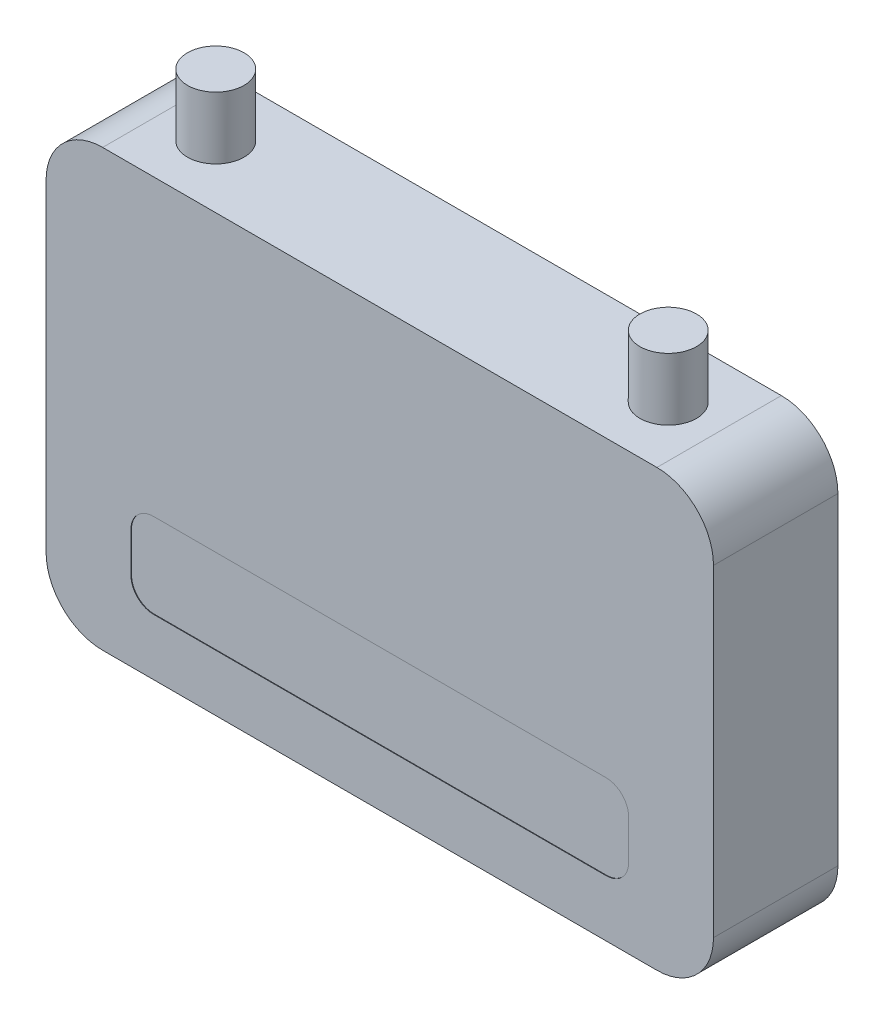
ISO-10303-21;
HEADER;
FILE_DESCRIPTION(('STEP AP214'),'2;1');
FILE_NAME('part.step','',(''),(''),'','','');
FILE_SCHEMA(('AUTOMOTIVE_DESIGN { 1 0 10303 214 1 1 1 1 }'));
ENDSEC;
DATA;
#1=APPLICATION_CONTEXT('core data for automotive mechanical design processes');
#2=APPLICATION_PROTOCOL_DEFINITION('international standard','automotive_design',2000,#1);
#3=PRODUCT_CONTEXT('',#1,'mechanical');
#4=PRODUCT('Part','Part','',(#3));
#5=PRODUCT_RELATED_PRODUCT_CATEGORY('part','',(#4));
#6=PRODUCT_DEFINITION_FORMATION('','',#4);
#7=PRODUCT_DEFINITION_CONTEXT('part definition',#1,'design');
#8=PRODUCT_DEFINITION('design','',#6,#7);
#9=PRODUCT_DEFINITION_SHAPE('','',#8);
#10=(LENGTH_UNIT() NAMED_UNIT(*) SI_UNIT(.MILLI.,.METRE.));
#11=(NAMED_UNIT(*) PLANE_ANGLE_UNIT() SI_UNIT($,.RADIAN.));
#12=(NAMED_UNIT(*) SI_UNIT($,.STERADIAN.) SOLID_ANGLE_UNIT());
#13=UNCERTAINTY_MEASURE_WITH_UNIT(LENGTH_MEASURE(1.E-05),#10,'distance_accuracy_value','');
#14=(GEOMETRIC_REPRESENTATION_CONTEXT(3) GLOBAL_UNCERTAINTY_ASSIGNED_CONTEXT((#13)) GLOBAL_UNIT_ASSIGNED_CONTEXT((#10,
#11,#12)) REPRESENTATION_CONTEXT('',''));
#15=CARTESIAN_POINT('',(0.,0.,0.));
#16=DIRECTION('',(0.,0.,1.));
#17=DIRECTION('',(1.,0.,0.));
#18=AXIS2_PLACEMENT_3D('',#15,#16,#17);
#19=CARTESIAN_POINT('',(49.,28.5,11.));
#20=DIRECTION('',(0.,0.,-1.));
#21=DIRECTION('',(-1.,0.,0.));
#22=AXIS2_PLACEMENT_3D('',#19,#20,#21);
#23=CYLINDRICAL_SURFACE('',#22,10.);
#24=CARTESIAN_POINT('',(49.,28.5,-11.));
#25=DIRECTION('',(0.,0.,1.));
#26=DIRECTION('',(-1.,0.,0.));
#27=AXIS2_PLACEMENT_3D('',#24,#25,#26);
#28=CIRCLE('',#27,10.);
#29=CARTESIAN_POINT('',(59.,28.4999999999999,-11.));
#30=VERTEX_POINT('',#29);
#31=CARTESIAN_POINT('',(48.9999999999999,38.5,-11.));
#32=VERTEX_POINT('',#31);
#33=EDGE_CURVE('E147',#30,#32,#28,.T.);
#34=ORIENTED_EDGE('',*,*,#33,.T.);
#35=DIRECTION('',(0.,0.,-1.));
#36=VECTOR('',#35,1.);
#37=CARTESIAN_POINT('',(48.9999999999999,38.5,11.));
#38=LINE('',#37,#36);
#39=CARTESIAN_POINT('',(48.9999999999999,38.5,11.));
#40=VERTEX_POINT('',#39);
#41=EDGE_CURVE('E176',#40,#32,#38,.T.);
#42=ORIENTED_EDGE('',*,*,#41,.F.);
#43=CARTESIAN_POINT('',(49.,28.5,11.));
#44=DIRECTION('',(0.,0.,1.));
#45=DIRECTION('',(-1.,0.,0.));
#46=AXIS2_PLACEMENT_3D('',#43,#44,#45);
#47=CIRCLE('',#46,10.);
#48=CARTESIAN_POINT('',(59.,28.4999999999999,11.));
#49=VERTEX_POINT('',#48);
#50=EDGE_CURVE('E163',#49,#40,#47,.T.);
#51=ORIENTED_EDGE('',*,*,#50,.F.);
#52=DIRECTION('',(0.,0.,-1.));
#53=VECTOR('',#52,1.);
#54=CARTESIAN_POINT('',(59.,28.4999999999999,11.));
#55=LINE('',#54,#53);
#56=EDGE_CURVE('E143',#49,#30,#55,.T.);
#57=ORIENTED_EDGE('',*,*,#56,.T.);
#58=EDGE_LOOP('',(#34,#42,#51,#57));
#59=FACE_BOUND('',#58,.T.);
#60=ADVANCED_FACE('F37',(#59),#23,.T.);
#61=CARTESIAN_POINT('',(-48.9999999999999,38.5,11.));
#62=DIRECTION('',(0.,-1.,0.));
#63=DIRECTION('',(0.,0.,-1.));
#64=AXIS2_PLACEMENT_3D('',#61,#62,#63);
#65=PLANE('',#64);
#66=CARTESIAN_POINT('',(40.,38.5,0.));
#67=DIRECTION('',(0.,-1.,0.));
#68=DIRECTION('',(0.,0.,-1.));
#69=AXIS2_PLACEMENT_3D('',#66,#67,#68);
#70=CIRCLE('',#69,5.);
#71=CARTESIAN_POINT('',(40.,38.5,-5.00000000000001));
#72=VERTEX_POINT('',#71);
#73=EDGE_CURVE('E181',#72,#72,#70,.F.);
#74=ORIENTED_EDGE('',*,*,#73,.F.);
#75=EDGE_LOOP('',(#74));
#76=FACE_BOUND('',#75,.T.);
#77=CARTESIAN_POINT('',(-40.,38.5,0.));
#78=DIRECTION('',(0.,-1.,0.));
#79=DIRECTION('',(0.,0.,-1.));
#80=AXIS2_PLACEMENT_3D('',#77,#78,#79);
#81=CIRCLE('',#80,5.);
#82=CARTESIAN_POINT('',(-40.,38.5,-5.));
#83=VERTEX_POINT('',#82);
#84=EDGE_CURVE('E178',#83,#83,#81,.F.);
#85=ORIENTED_EDGE('',*,*,#84,.F.);
#86=EDGE_LOOP('',(#85));
#87=FACE_BOUND('',#86,.T.);
#88=DIRECTION('',(-1.,0.,0.));
#89=VECTOR('',#88,1.);
#90=CARTESIAN_POINT('',(-48.9999999999999,38.5,-11.));
#91=LINE('',#90,#89);
#92=CARTESIAN_POINT('',(-48.9999999999999,38.5,-11.));
#93=VERTEX_POINT('',#92);
#94=EDGE_CURVE('E150',#32,#93,#91,.T.);
#95=ORIENTED_EDGE('',*,*,#94,.T.);
#96=DIRECTION('',(0.,0.,-1.));
#97=VECTOR('',#96,1.);
#98=CARTESIAN_POINT('',(-48.9999999999999,38.5,11.));
#99=LINE('',#98,#97);
#100=CARTESIAN_POINT('',(-48.9999999999999,38.5,11.));
#101=VERTEX_POINT('',#100);
#102=EDGE_CURVE('E173',#101,#93,#99,.T.);
#103=ORIENTED_EDGE('',*,*,#102,.F.);
#104=DIRECTION('',(-1.,0.,0.));
#105=VECTOR('',#104,1.);
#106=CARTESIAN_POINT('',(-48.9999999999999,38.5,11.));
#107=LINE('',#106,#105);
#108=EDGE_CURVE('E103',#40,#101,#107,.T.);
#109=ORIENTED_EDGE('',*,*,#108,.F.);
#110=ORIENTED_EDGE('',*,*,#41,.T.);
#111=EDGE_LOOP('',(#95,#103,#109,#110));
#112=FACE_BOUND('',#111,.T.);
#113=ADVANCED_FACE('F223',(#76,#87,#112),#65,.F.);
#114=CARTESIAN_POINT('',(-49.,28.5,11.));
#115=DIRECTION('',(0.,0.,-1.));
#116=DIRECTION('',(-1.,0.,0.));
#117=AXIS2_PLACEMENT_3D('',#114,#115,#116);
#118=CYLINDRICAL_SURFACE('',#117,10.);
#119=CARTESIAN_POINT('',(-49.,28.5,-11.));
#120=DIRECTION('',(0.,0.,1.));
#121=DIRECTION('',(-1.,0.,0.));
#122=AXIS2_PLACEMENT_3D('',#119,#120,#121);
#123=CIRCLE('',#122,10.);
#124=CARTESIAN_POINT('',(-59.,28.4999999999999,-11.));
#125=VERTEX_POINT('',#124);
#126=EDGE_CURVE('E153',#93,#125,#123,.T.);
#127=ORIENTED_EDGE('',*,*,#126,.T.);
#128=DIRECTION('',(0.,0.,-1.));
#129=VECTOR('',#128,1.);
#130=CARTESIAN_POINT('',(-59.,28.4999999999999,11.));
#131=LINE('',#130,#129);
#132=CARTESIAN_POINT('',(-59.,28.4999999999999,11.));
#133=VERTEX_POINT('',#132);
#134=EDGE_CURVE('E170',#133,#125,#131,.T.);
#135=ORIENTED_EDGE('',*,*,#134,.F.);
#136=CARTESIAN_POINT('',(-49.,28.5,11.));
#137=DIRECTION('',(0.,0.,1.));
#138=DIRECTION('',(-1.,0.,0.));
#139=AXIS2_PLACEMENT_3D('',#136,#137,#138);
#140=CIRCLE('',#139,10.);
#141=EDGE_CURVE('E310',#101,#133,#140,.T.);
#142=ORIENTED_EDGE('',*,*,#141,.F.);
#143=ORIENTED_EDGE('',*,*,#102,.T.);
#144=EDGE_LOOP('',(#127,#135,#142,#143));
#145=FACE_BOUND('',#144,.T.);
#146=ADVANCED_FACE('F229',(#145),#118,.T.);
#147=CARTESIAN_POINT('',(-59.,-28.4999999999999,11.));
#148=DIRECTION('',(1.,0.,0.));
#149=DIRECTION('',(0.,0.,-1.));
#150=AXIS2_PLACEMENT_3D('',#147,#148,#149);
#151=PLANE('',#150);
#152=DIRECTION('',(0.,-1.,0.));
#153=VECTOR('',#152,1.);
#154=CARTESIAN_POINT('',(-59.,-28.4999999999999,-11.));
#155=LINE('',#154,#153);
#156=CARTESIAN_POINT('',(-59.,-28.4999999999999,-11.));
#157=VERTEX_POINT('',#156);
#158=EDGE_CURVE('E155',#125,#157,#155,.T.);
#159=ORIENTED_EDGE('',*,*,#158,.T.);
#160=DIRECTION('',(0.,0.,-1.));
#161=VECTOR('',#160,1.);
#162=CARTESIAN_POINT('',(-59.,-28.4999999999999,11.));
#163=LINE('',#162,#161);
#164=CARTESIAN_POINT('',(-59.,-28.4999999999999,11.));
#165=VERTEX_POINT('',#164);
#166=EDGE_CURVE('E167',#165,#157,#163,.T.);
#167=ORIENTED_EDGE('',*,*,#166,.F.);
#168=DIRECTION('',(0.,-1.,0.));
#169=VECTOR('',#168,1.);
#170=CARTESIAN_POINT('',(-59.,-28.4999999999999,11.));
#171=LINE('',#170,#169);
#172=EDGE_CURVE('E307',#133,#165,#171,.T.);
#173=ORIENTED_EDGE('',*,*,#172,.F.);
#174=ORIENTED_EDGE('',*,*,#134,.T.);
#175=EDGE_LOOP('',(#159,#167,#173,#174));
#176=FACE_BOUND('',#175,.T.);
#177=ADVANCED_FACE('F292',(#176),#151,.F.);
#178=CARTESIAN_POINT('',(-49.,-28.5,11.));
#179=DIRECTION('',(0.,0.,-1.));
#180=DIRECTION('',(-1.,0.,0.));
#181=AXIS2_PLACEMENT_3D('',#178,#179,#180);
#182=CYLINDRICAL_SURFACE('',#181,10.);
#183=CARTESIAN_POINT('',(-49.,-28.5,-11.));
#184=DIRECTION('',(0.,0.,1.));
#185=DIRECTION('',(-1.,0.,0.));
#186=AXIS2_PLACEMENT_3D('',#183,#184,#185);
#187=CIRCLE('',#186,10.);
#188=CARTESIAN_POINT('',(-48.9999999999999,-38.5,-11.));
#189=VERTEX_POINT('',#188);
#190=EDGE_CURVE('E157',#157,#189,#187,.T.);
#191=ORIENTED_EDGE('',*,*,#190,.T.);
#192=DIRECTION('',(0.,0.,-1.));
#193=VECTOR('',#192,1.);
#194=CARTESIAN_POINT('',(-48.9999999999999,-38.5,11.));
#195=LINE('',#194,#193);
#196=CARTESIAN_POINT('',(-48.9999999999999,-38.5,11.));
#197=VERTEX_POINT('',#196);
#198=EDGE_CURVE('E138',#197,#189,#195,.T.);
#199=ORIENTED_EDGE('',*,*,#198,.F.);
#200=CARTESIAN_POINT('',(-49.,-28.5,11.));
#201=DIRECTION('',(0.,0.,1.));
#202=DIRECTION('',(-1.,0.,0.));
#203=AXIS2_PLACEMENT_3D('',#200,#201,#202);
#204=CIRCLE('',#203,10.);
#205=EDGE_CURVE('E126',#165,#197,#204,.T.);
#206=ORIENTED_EDGE('',*,*,#205,.F.);
#207=ORIENTED_EDGE('',*,*,#166,.T.);
#208=EDGE_LOOP('',(#191,#199,#206,#207));
#209=FACE_BOUND('',#208,.T.);
#210=ADVANCED_FACE('F289',(#209),#182,.T.);
#211=CARTESIAN_POINT('',(-48.9999999999999,-38.5,11.));
#212=DIRECTION('',(0.,1.,0.));
#213=DIRECTION('',(0.,0.,1.));
#214=AXIS2_PLACEMENT_3D('',#211,#212,#213);
#215=PLANE('',#214);
#216=DIRECTION('',(1.,0.,0.));
#217=VECTOR('',#216,1.);
#218=CARTESIAN_POINT('',(-48.9999999999999,-38.5,-11.));
#219=LINE('',#218,#217);
#220=CARTESIAN_POINT('',(48.9999999999999,-38.5,-11.));
#221=VERTEX_POINT('',#220);
#222=EDGE_CURVE('E135',#189,#221,#219,.T.);
#223=ORIENTED_EDGE('',*,*,#222,.T.);
#224=DIRECTION('',(0.,0.,-1.));
#225=VECTOR('',#224,1.);
#226=CARTESIAN_POINT('',(48.9999999999999,-38.5,11.));
#227=LINE('',#226,#225);
#228=CARTESIAN_POINT('',(48.9999999999999,-38.5,11.));
#229=VERTEX_POINT('',#228);
#230=EDGE_CURVE('E132',#229,#221,#227,.T.);
#231=ORIENTED_EDGE('',*,*,#230,.F.);
#232=DIRECTION('',(1.,0.,0.));
#233=VECTOR('',#232,1.);
#234=CARTESIAN_POINT('',(-48.9999999999999,-38.5,11.));
#235=LINE('',#234,#233);
#236=EDGE_CURVE('E119',#197,#229,#235,.T.);
#237=ORIENTED_EDGE('',*,*,#236,.F.);
#238=ORIENTED_EDGE('',*,*,#198,.T.);
#239=EDGE_LOOP('',(#223,#231,#237,#238));
#240=FACE_BOUND('',#239,.T.);
#241=ADVANCED_FACE('F133',(#240),#215,.F.);
#242=CARTESIAN_POINT('',(49.,-28.5,11.));
#243=DIRECTION('',(0.,0.,-1.));
#244=DIRECTION('',(-1.,0.,0.));
#245=AXIS2_PLACEMENT_3D('',#242,#243,#244);
#246=CYLINDRICAL_SURFACE('',#245,10.);
#247=CARTESIAN_POINT('',(49.,-28.5,-11.));
#248=DIRECTION('',(0.,0.,1.));
#249=DIRECTION('',(1.,0.,0.));
#250=AXIS2_PLACEMENT_3D('',#247,#248,#249);
#251=CIRCLE('',#250,10.);
#252=CARTESIAN_POINT('',(59.,-28.5,-11.));
#253=VERTEX_POINT('',#252);
#254=EDGE_CURVE('E160',#221,#253,#251,.T.);
#255=ORIENTED_EDGE('',*,*,#254,.T.);
#256=DIRECTION('',(0.,0.,-1.));
#257=VECTOR('',#256,1.);
#258=CARTESIAN_POINT('',(59.,-28.5,11.));
#259=LINE('',#258,#257);
#260=CARTESIAN_POINT('',(59.,-28.5,11.));
#261=VERTEX_POINT('',#260);
#262=EDGE_CURVE('E139',#261,#253,#259,.T.);
#263=ORIENTED_EDGE('',*,*,#262,.F.);
#264=CARTESIAN_POINT('',(49.,-28.5,11.));
#265=DIRECTION('',(0.,0.,1.));
#266=DIRECTION('',(1.,0.,0.));
#267=AXIS2_PLACEMENT_3D('',#264,#265,#266);
#268=CIRCLE('',#267,10.);
#269=EDGE_CURVE('E123',#229,#261,#268,.T.);
#270=ORIENTED_EDGE('',*,*,#269,.F.);
#271=ORIENTED_EDGE('',*,*,#230,.T.);
#272=EDGE_LOOP('',(#255,#263,#270,#271));
#273=FACE_BOUND('',#272,.T.);
#274=ADVANCED_FACE('F141',(#273),#246,.T.);
#275=CARTESIAN_POINT('',(59.,-28.4999999999999,11.));
#276=DIRECTION('',(-1.,0.,0.));
#277=DIRECTION('',(0.,0.,1.));
#278=AXIS2_PLACEMENT_3D('',#275,#276,#277);
#279=PLANE('',#278);
#280=DIRECTION('',(0.,1.,0.));
#281=VECTOR('',#280,1.);
#282=CARTESIAN_POINT('',(59.,-28.4999999999999,-11.));
#283=LINE('',#282,#281);
#284=EDGE_CURVE('E94',#253,#30,#283,.T.);
#285=ORIENTED_EDGE('',*,*,#284,.T.);
#286=ORIENTED_EDGE('',*,*,#56,.F.);
#287=DIRECTION('',(0.,1.,0.));
#288=VECTOR('',#287,1.);
#289=CARTESIAN_POINT('',(59.,-28.4999999999999,11.));
#290=LINE('',#289,#288);
#291=EDGE_CURVE('E61',#261,#49,#290,.T.);
#292=ORIENTED_EDGE('',*,*,#291,.F.);
#293=ORIENTED_EDGE('',*,*,#262,.T.);
#294=EDGE_LOOP('',(#285,#286,#292,#293));
#295=FACE_BOUND('',#294,.T.);
#296=ADVANCED_FACE('F278',(#295),#279,.F.);
#297=CARTESIAN_POINT('',(49.,28.5,11.));
#298=DIRECTION('',(0.,0.,-1.));
#299=DIRECTION('',(-1.,0.,0.));
#300=AXIS2_PLACEMENT_3D('',#297,#298,#299);
#301=PLANE('',#300);
#302=DIRECTION('',(-1.,0.,0.));
#303=VECTOR('',#302,1.);
#304=CARTESIAN_POINT('',(-40.,-13.5,11.));
#305=LINE('',#304,#303);
#306=CARTESIAN_POINT('',(40.,-13.5,11.));
#307=VERTEX_POINT('',#306);
#308=CARTESIAN_POINT('',(-40.,-13.5,11.));
#309=VERTEX_POINT('',#308);
#310=EDGE_CURVE('E361',#307,#309,#305,.T.);
#311=ORIENTED_EDGE('',*,*,#310,.F.);
#312=CARTESIAN_POINT('',(40.,-17.5,11.));
#313=DIRECTION('',(0.,0.,1.));
#314=DIRECTION('',(-1.,0.,0.));
#315=AXIS2_PLACEMENT_3D('',#312,#313,#314);
#316=CIRCLE('',#315,4.);
#317=CARTESIAN_POINT('',(44.,-17.5,11.));
#318=VERTEX_POINT('',#317);
#319=EDGE_CURVE('E52',#318,#307,#316,.T.);
#320=ORIENTED_EDGE('',*,*,#319,.F.);
#321=DIRECTION('',(0.,1.,0.));
#322=VECTOR('',#321,1.);
#323=CARTESIAN_POINT('',(44.,-24.5,11.));
#324=LINE('',#323,#322);
#325=CARTESIAN_POINT('',(44.,-24.5,11.));
#326=VERTEX_POINT('',#325);
#327=EDGE_CURVE('E342',#326,#318,#324,.T.);
#328=ORIENTED_EDGE('',*,*,#327,.F.);
#329=CARTESIAN_POINT('',(40.,-24.5,11.));
#330=DIRECTION('',(0.,0.,1.));
#331=DIRECTION('',(1.,0.,0.));
#332=AXIS2_PLACEMENT_3D('',#329,#330,#331);
#333=CIRCLE('',#332,4.);
#334=CARTESIAN_POINT('',(40.,-28.5,11.));
#335=VERTEX_POINT('',#334);
#336=EDGE_CURVE('E346',#335,#326,#333,.T.);
#337=ORIENTED_EDGE('',*,*,#336,.F.);
#338=DIRECTION('',(1.,0.,0.));
#339=VECTOR('',#338,1.);
#340=CARTESIAN_POINT('',(-40.,-28.5,11.));
#341=LINE('',#340,#339);
#342=CARTESIAN_POINT('',(-40.,-28.5,11.));
#343=VERTEX_POINT('',#342);
#344=EDGE_CURVE('E349',#343,#335,#341,.T.);
#345=ORIENTED_EDGE('',*,*,#344,.F.);
#346=CARTESIAN_POINT('',(-40.,-24.5,11.));
#347=DIRECTION('',(0.,0.,1.));
#348=DIRECTION('',(-1.,0.,0.));
#349=AXIS2_PLACEMENT_3D('',#346,#347,#348);
#350=CIRCLE('',#349,4.);
#351=CARTESIAN_POINT('',(-44.,-24.5,11.));
#352=VERTEX_POINT('',#351);
#353=EDGE_CURVE('E352',#352,#343,#350,.T.);
#354=ORIENTED_EDGE('',*,*,#353,.F.);
#355=DIRECTION('',(0.,-1.,0.));
#356=VECTOR('',#355,1.);
#357=CARTESIAN_POINT('',(-44.,-24.5,11.));
#358=LINE('',#357,#356);
#359=CARTESIAN_POINT('',(-44.,-17.5,11.));
#360=VERTEX_POINT('',#359);
#361=EDGE_CURVE('E355',#360,#352,#358,.T.);
#362=ORIENTED_EDGE('',*,*,#361,.F.);
#363=CARTESIAN_POINT('',(-40.,-17.5,11.));
#364=DIRECTION('',(0.,0.,1.));
#365=DIRECTION('',(-1.,0.,0.));
#366=AXIS2_PLACEMENT_3D('',#363,#364,#365);
#367=CIRCLE('',#366,4.);
#368=EDGE_CURVE('E358',#309,#360,#367,.T.);
#369=ORIENTED_EDGE('',*,*,#368,.F.);
#370=EDGE_LOOP('',(#311,#320,#328,#337,#345,#354,#362,#369));
#371=FACE_BOUND('',#370,.T.);
#372=ORIENTED_EDGE('',*,*,#50,.T.);
#373=ORIENTED_EDGE('',*,*,#108,.T.);
#374=ORIENTED_EDGE('',*,*,#141,.T.);
#375=ORIENTED_EDGE('',*,*,#172,.T.);
#376=ORIENTED_EDGE('',*,*,#205,.T.);
#377=ORIENTED_EDGE('',*,*,#236,.T.);
#378=ORIENTED_EDGE('',*,*,#269,.T.);
#379=ORIENTED_EDGE('',*,*,#291,.T.);
#380=EDGE_LOOP('',(#372,#373,#374,#375,#376,#377,#378,#379));
#381=FACE_BOUND('',#380,.T.);
#382=ADVANCED_FACE('F121',(#371,#381),#301,.F.);
#383=CARTESIAN_POINT('',(49.,28.5,-11.));
#384=DIRECTION('',(0.,0.,-1.));
#385=DIRECTION('',(-1.,0.,0.));
#386=AXIS2_PLACEMENT_3D('',#383,#384,#385);
#387=PLANE('',#386);
#388=CARTESIAN_POINT('',(-48.,31.,-11.));
#389=DIRECTION('',(0.,0.,-1.));
#390=DIRECTION('',(-1.,0.,0.));
#391=AXIS2_PLACEMENT_3D('',#388,#389,#390);
#392=CIRCLE('',#391,3.25);
#393=CARTESIAN_POINT('',(-51.25,31.,-11.));
#394=VERTEX_POINT('',#393);
#395=EDGE_CURVE('E195',#394,#394,#392,.F.);
#396=ORIENTED_EDGE('',*,*,#395,.T.);
#397=EDGE_LOOP('',(#396));
#398=FACE_BOUND('',#397,.T.);
#399=CARTESIAN_POINT('',(-48.,-31.,-11.));
#400=DIRECTION('',(0.,0.,-1.));
#401=DIRECTION('',(-1.,0.,0.));
#402=AXIS2_PLACEMENT_3D('',#399,#400,#401);
#403=CIRCLE('',#402,3.25);
#404=CARTESIAN_POINT('',(-51.25,-31.,-11.));
#405=VERTEX_POINT('',#404);
#406=EDGE_CURVE('E192',#405,#405,#403,.F.);
#407=ORIENTED_EDGE('',*,*,#406,.T.);
#408=EDGE_LOOP('',(#407));
#409=FACE_BOUND('',#408,.T.);
#410=CARTESIAN_POINT('',(48.,-31.,-11.));
#411=DIRECTION('',(0.,0.,-1.));
#412=DIRECTION('',(-1.,0.,0.));
#413=AXIS2_PLACEMENT_3D('',#410,#411,#412);
#414=CIRCLE('',#413,3.25);
#415=CARTESIAN_POINT('',(44.75,-31.,-11.));
#416=VERTEX_POINT('',#415);
#417=EDGE_CURVE('E189',#416,#416,#414,.F.);
#418=ORIENTED_EDGE('',*,*,#417,.T.);
#419=EDGE_LOOP('',(#418));
#420=FACE_BOUND('',#419,.T.);
#421=CARTESIAN_POINT('',(48.,31.,-11.));
#422=DIRECTION('',(0.,0.,-1.));
#423=DIRECTION('',(-1.,0.,0.));
#424=AXIS2_PLACEMENT_3D('',#421,#422,#423);
#425=CIRCLE('',#424,3.25);
#426=CARTESIAN_POINT('',(44.75,31.,-11.));
#427=VERTEX_POINT('',#426);
#428=EDGE_CURVE('E185',#427,#427,#425,.F.);
#429=ORIENTED_EDGE('',*,*,#428,.T.);
#430=EDGE_LOOP('',(#429));
#431=FACE_BOUND('',#430,.T.);
#432=ORIENTED_EDGE('',*,*,#33,.F.);
#433=ORIENTED_EDGE('',*,*,#284,.F.);
#434=ORIENTED_EDGE('',*,*,#254,.F.);
#435=ORIENTED_EDGE('',*,*,#222,.F.);
#436=ORIENTED_EDGE('',*,*,#190,.F.);
#437=ORIENTED_EDGE('',*,*,#158,.F.);
#438=ORIENTED_EDGE('',*,*,#126,.F.);
#439=ORIENTED_EDGE('',*,*,#94,.F.);
#440=EDGE_LOOP('',(#432,#433,#434,#435,#436,#437,#438,#439));
#441=FACE_BOUND('',#440,.T.);
#442=ADVANCED_FACE('F274',(#398,#409,#420,#431,#441),#387,.T.);
#443=CARTESIAN_POINT('',(-40.,49.5,0.));
#444=DIRECTION('',(0.,-1.,0.));
#445=DIRECTION('',(0.,0.,-1.));
#446=AXIS2_PLACEMENT_3D('',#443,#444,#445);
#447=CYLINDRICAL_SURFACE('',#446,5.);
#448=CARTESIAN_POINT('',(-40.,49.5,0.));
#449=DIRECTION('',(0.,1.,0.));
#450=DIRECTION('',(0.,0.,1.));
#451=AXIS2_PLACEMENT_3D('',#448,#449,#450);
#452=CIRCLE('',#451,5.);
#453=CARTESIAN_POINT('',(-40.,49.5,5.));
#454=VERTEX_POINT('',#453);
#455=EDGE_CURVE('E151',#454,#454,#452,.T.);
#456=ORIENTED_EDGE('',*,*,#455,.F.);
#457=EDGE_LOOP('',(#456));
#458=FACE_BOUND('',#457,.T.);
#459=ORIENTED_EDGE('',*,*,#84,.T.);
#460=EDGE_LOOP('',(#459));
#461=FACE_BOUND('',#460,.T.);
#462=ADVANCED_FACE('F270',(#458,#461),#447,.T.);
#463=CARTESIAN_POINT('',(-40.,49.5,0.));
#464=DIRECTION('',(0.,1.,0.));
#465=DIRECTION('',(0.,0.,1.));
#466=AXIS2_PLACEMENT_3D('',#463,#464,#465);
#467=PLANE('',#466);
#468=ORIENTED_EDGE('',*,*,#455,.T.);
#469=EDGE_LOOP('',(#468));
#470=FACE_BOUND('',#469,.T.);
#471=ADVANCED_FACE('F263',(#470),#467,.T.);
#472=CARTESIAN_POINT('',(40.,49.5,0.));
#473=DIRECTION('',(0.,-1.,0.));
#474=DIRECTION('',(0.,0.,-1.));
#475=AXIS2_PLACEMENT_3D('',#472,#473,#474);
#476=CYLINDRICAL_SURFACE('',#475,5.);
#477=CARTESIAN_POINT('',(40.,49.5,0.));
#478=DIRECTION('',(0.,1.,0.));
#479=DIRECTION('',(0.,0.,1.));
#480=AXIS2_PLACEMENT_3D('',#477,#478,#479);
#481=CIRCLE('',#480,5.);
#482=CARTESIAN_POINT('',(40.,49.5,4.99999999999998));
#483=VERTEX_POINT('',#482);
#484=EDGE_CURVE('E188',#483,#483,#481,.T.);
#485=ORIENTED_EDGE('',*,*,#484,.F.);
#486=EDGE_LOOP('',(#485));
#487=FACE_BOUND('',#486,.T.);
#488=ORIENTED_EDGE('',*,*,#73,.T.);
#489=EDGE_LOOP('',(#488));
#490=FACE_BOUND('',#489,.T.);
#491=ADVANCED_FACE('F260',(#487,#490),#476,.T.);
#492=CARTESIAN_POINT('',(40.,49.5,0.));
#493=DIRECTION('',(0.,1.,0.));
#494=DIRECTION('',(0.,0.,1.));
#495=AXIS2_PLACEMENT_3D('',#492,#493,#494);
#496=PLANE('',#495);
#497=ORIENTED_EDGE('',*,*,#484,.T.);
#498=EDGE_LOOP('',(#497));
#499=FACE_BOUND('',#498,.T.);
#500=ADVANCED_FACE('F258',(#499),#496,.T.);
#501=CARTESIAN_POINT('',(48.,31.,-12.));
#502=DIRECTION('',(0.,0.,-1.));
#503=DIRECTION('',(-1.,0.,0.));
#504=AXIS2_PLACEMENT_3D('',#501,#502,#503);
#505=PLANE('',#504);
#506=CARTESIAN_POINT('',(48.,31.,-12.));
#507=DIRECTION('',(0.,0.,-1.));
#508=DIRECTION('',(-1.,0.,0.));
#509=AXIS2_PLACEMENT_3D('',#506,#507,#508);
#510=CIRCLE('',#509,1.51794919243112);
#511=CARTESIAN_POINT('',(46.4820508075689,31.,-12.));
#512=VERTEX_POINT('',#511);
#513=EDGE_CURVE('E11',#512,#512,#510,.T.);
#514=ORIENTED_EDGE('',*,*,#513,.T.);
#515=EDGE_LOOP('',(#514));
#516=FACE_BOUND('',#515,.T.);
#517=ADVANCED_FACE('F251',(#516),#505,.T.);
#518=CARTESIAN_POINT('',(48.,-31.,-12.));
#519=DIRECTION('',(0.,0.,-1.));
#520=DIRECTION('',(-1.,0.,0.));
#521=AXIS2_PLACEMENT_3D('',#518,#519,#520);
#522=PLANE('',#521);
#523=CARTESIAN_POINT('',(48.,-31.,-12.));
#524=DIRECTION('',(0.,0.,-1.));
#525=DIRECTION('',(-1.,0.,0.));
#526=AXIS2_PLACEMENT_3D('',#523,#524,#525);
#527=CIRCLE('',#526,1.51794919243112);
#528=CARTESIAN_POINT('',(46.4820508075689,-31.,-12.));
#529=VERTEX_POINT('',#528);
#530=EDGE_CURVE('E201',#529,#529,#527,.T.);
#531=ORIENTED_EDGE('',*,*,#530,.T.);
#532=EDGE_LOOP('',(#531));
#533=FACE_BOUND('',#532,.T.);
#534=ADVANCED_FACE('F246',(#533),#522,.T.);
#535=CARTESIAN_POINT('',(-48.,-31.,-12.));
#536=DIRECTION('',(0.,0.,-1.));
#537=DIRECTION('',(-1.,0.,0.));
#538=AXIS2_PLACEMENT_3D('',#535,#536,#537);
#539=PLANE('',#538);
#540=CARTESIAN_POINT('',(-48.,-31.,-12.));
#541=DIRECTION('',(0.,0.,-1.));
#542=DIRECTION('',(-1.,0.,0.));
#543=AXIS2_PLACEMENT_3D('',#540,#541,#542);
#544=CIRCLE('',#543,1.51794919243112);
#545=CARTESIAN_POINT('',(-49.5179491924311,-31.,-12.));
#546=VERTEX_POINT('',#545);
#547=EDGE_CURVE('E184',#546,#546,#544,.T.);
#548=ORIENTED_EDGE('',*,*,#547,.T.);
#549=EDGE_LOOP('',(#548));
#550=FACE_BOUND('',#549,.T.);
#551=ADVANCED_FACE('F239',(#550),#539,.T.);
#552=CARTESIAN_POINT('',(-48.,31.,-12.));
#553=DIRECTION('',(0.,0.,-1.));
#554=DIRECTION('',(-1.,0.,0.));
#555=AXIS2_PLACEMENT_3D('',#552,#553,#554);
#556=PLANE('',#555);
#557=CARTESIAN_POINT('',(-48.,31.,-12.));
#558=DIRECTION('',(0.,0.,-1.));
#559=DIRECTION('',(-1.,0.,0.));
#560=AXIS2_PLACEMENT_3D('',#557,#558,#559);
#561=CIRCLE('',#560,1.51794919243112);
#562=CARTESIAN_POINT('',(-49.5179491924311,31.,-12.));
#563=VERTEX_POINT('',#562);
#564=EDGE_CURVE('E45',#563,#563,#561,.T.);
#565=ORIENTED_EDGE('',*,*,#564,.T.);
#566=EDGE_LOOP('',(#565));
#567=FACE_BOUND('',#566,.T.);
#568=ADVANCED_FACE('F206',(#567),#556,.T.);
#569=CARTESIAN_POINT('',(-48.,-31.,-10.));
#570=DIRECTION('',(0.,0.,1.));
#571=DIRECTION('',(1.,0.,0.));
#572=AXIS2_PLACEMENT_3D('',#569,#570,#571);
#573=DEGENERATE_TOROIDAL_SURFACE('',#572,1.51794919243112,2.,.T.);
#574=ORIENTED_EDGE('',*,*,#406,.F.);
#575=EDGE_LOOP('',(#574));
#576=FACE_BOUND('',#575,.T.);
#577=ORIENTED_EDGE('',*,*,#547,.F.);
#578=EDGE_LOOP('',(#577));
#579=FACE_BOUND('',#578,.T.);
#580=ADVANCED_FACE('F218',(#576,#579),#573,.T.);
#581=CARTESIAN_POINT('',(48.,-31.,-10.));
#582=DIRECTION('',(0.,0.,1.));
#583=DIRECTION('',(1.,0.,0.));
#584=AXIS2_PLACEMENT_3D('',#581,#582,#583);
#585=DEGENERATE_TOROIDAL_SURFACE('',#584,1.51794919243112,2.,.T.);
#586=ORIENTED_EDGE('',*,*,#417,.F.);
#587=EDGE_LOOP('',(#586));
#588=FACE_BOUND('',#587,.T.);
#589=ORIENTED_EDGE('',*,*,#530,.F.);
#590=EDGE_LOOP('',(#589));
#591=FACE_BOUND('',#590,.T.);
#592=ADVANCED_FACE('F210',(#588,#591),#585,.T.);
#593=CARTESIAN_POINT('',(-48.,31.,-10.));
#594=DIRECTION('',(0.,0.,1.));
#595=DIRECTION('',(1.,0.,0.));
#596=AXIS2_PLACEMENT_3D('',#593,#594,#595);
#597=DEGENERATE_TOROIDAL_SURFACE('',#596,1.51794919243112,2.,.T.);
#598=ORIENTED_EDGE('',*,*,#395,.F.);
#599=EDGE_LOOP('',(#598));
#600=FACE_BOUND('',#599,.T.);
#601=ORIENTED_EDGE('',*,*,#564,.F.);
#602=EDGE_LOOP('',(#601));
#603=FACE_BOUND('',#602,.T.);
#604=ADVANCED_FACE('F208',(#600,#603),#597,.T.);
#605=CARTESIAN_POINT('',(48.,31.,-10.));
#606=DIRECTION('',(0.,0.,1.));
#607=DIRECTION('',(1.,0.,0.));
#608=AXIS2_PLACEMENT_3D('',#605,#606,#607);
#609=DEGENERATE_TOROIDAL_SURFACE('',#608,1.51794919243112,2.,.T.);
#610=ORIENTED_EDGE('',*,*,#428,.F.);
#611=EDGE_LOOP('',(#610));
#612=FACE_BOUND('',#611,.T.);
#613=ORIENTED_EDGE('',*,*,#513,.F.);
#614=EDGE_LOOP('',(#613));
#615=FACE_BOUND('',#614,.T.);
#616=ADVANCED_FACE('F39',(#612,#615),#609,.T.);
#617=CARTESIAN_POINT('',(40.,-17.5,10.9));
#618=DIRECTION('',(0.,0.,1.));
#619=DIRECTION('',(1.,0.,0.));
#620=AXIS2_PLACEMENT_3D('',#617,#618,#619);
#621=CYLINDRICAL_SURFACE('',#620,4.);
#622=ORIENTED_EDGE('',*,*,#319,.T.);
#623=DIRECTION('',(0.,0.,1.));
#624=VECTOR('',#623,1.);
#625=CARTESIAN_POINT('',(40.,-13.5,10.9));
#626=LINE('',#625,#624);
#627=CARTESIAN_POINT('',(40.,-13.5,10.9));
#628=VERTEX_POINT('',#627);
#629=EDGE_CURVE('E320',#628,#307,#626,.T.);
#630=ORIENTED_EDGE('',*,*,#629,.F.);
#631=CARTESIAN_POINT('',(40.,-17.5,10.9));
#632=DIRECTION('',(0.,0.,1.));
#633=DIRECTION('',(-1.,0.,0.));
#634=AXIS2_PLACEMENT_3D('',#631,#632,#633);
#635=CIRCLE('',#634,4.);
#636=CARTESIAN_POINT('',(44.,-17.5,10.9));
#637=VERTEX_POINT('',#636);
#638=EDGE_CURVE('E345',#637,#628,#635,.T.);
#639=ORIENTED_EDGE('',*,*,#638,.F.);
#640=DIRECTION('',(0.,0.,1.));
#641=VECTOR('',#640,1.);
#642=CARTESIAN_POINT('',(44.,-17.5,10.9));
#643=LINE('',#642,#641);
#644=EDGE_CURVE('E198',#637,#318,#643,.T.);
#645=ORIENTED_EDGE('',*,*,#644,.T.);
#646=EDGE_LOOP('',(#622,#630,#639,#645));
#647=FACE_BOUND('',#646,.T.);
#648=ADVANCED_FACE('F216',(#647),#621,.F.);
#649=CARTESIAN_POINT('',(44.,-24.5,10.9));
#650=DIRECTION('',(1.,0.,0.));
#651=DIRECTION('',(0.,1.,0.));
#652=AXIS2_PLACEMENT_3D('',#649,#650,#651);
#653=PLANE('',#652);
#654=ORIENTED_EDGE('',*,*,#327,.T.);
#655=ORIENTED_EDGE('',*,*,#644,.F.);
#656=DIRECTION('',(0.,1.,0.));
#657=VECTOR('',#656,1.);
#658=CARTESIAN_POINT('',(44.,-24.5,10.9));
#659=LINE('',#658,#657);
#660=CARTESIAN_POINT('',(44.,-24.5,10.9));
#661=VERTEX_POINT('',#660);
#662=EDGE_CURVE('E323',#661,#637,#659,.T.);
#663=ORIENTED_EDGE('',*,*,#662,.F.);
#664=DIRECTION('',(0.,0.,1.));
#665=VECTOR('',#664,1.);
#666=CARTESIAN_POINT('',(44.,-24.5,10.9));
#667=LINE('',#666,#665);
#668=EDGE_CURVE('E338',#661,#326,#667,.T.);
#669=ORIENTED_EDGE('',*,*,#668,.T.);
#670=EDGE_LOOP('',(#654,#655,#663,#669));
#671=FACE_BOUND('',#670,.T.);
#672=ADVANCED_FACE('F413',(#671),#653,.F.);
#673=CARTESIAN_POINT('',(40.,-24.5,10.9));
#674=DIRECTION('',(0.,0.,1.));
#675=DIRECTION('',(1.,0.,0.));
#676=AXIS2_PLACEMENT_3D('',#673,#674,#675);
#677=CYLINDRICAL_SURFACE('',#676,4.);
#678=ORIENTED_EDGE('',*,*,#336,.T.);
#679=ORIENTED_EDGE('',*,*,#668,.F.);
#680=CARTESIAN_POINT('',(40.,-24.5,10.9));
#681=DIRECTION('',(0.,0.,1.));
#682=DIRECTION('',(1.,0.,0.));
#683=AXIS2_PLACEMENT_3D('',#680,#681,#682);
#684=CIRCLE('',#683,4.);
#685=CARTESIAN_POINT('',(40.,-28.5,10.9));
#686=VERTEX_POINT('',#685);
#687=EDGE_CURVE('E367',#686,#661,#684,.T.);
#688=ORIENTED_EDGE('',*,*,#687,.F.);
#689=DIRECTION('',(0.,0.,1.));
#690=VECTOR('',#689,1.);
#691=CARTESIAN_POINT('',(40.,-28.5,10.9));
#692=LINE('',#691,#690);
#693=EDGE_CURVE('E335',#686,#335,#692,.T.);
#694=ORIENTED_EDGE('',*,*,#693,.T.);
#695=EDGE_LOOP('',(#678,#679,#688,#694));
#696=FACE_BOUND('',#695,.T.);
#697=ADVANCED_FACE('F418',(#696),#677,.F.);
#698=CARTESIAN_POINT('',(-40.,-28.5,10.9));
#699=DIRECTION('',(0.,-1.,0.));
#700=DIRECTION('',(0.,0.,-1.));
#701=AXIS2_PLACEMENT_3D('',#698,#699,#700);
#702=PLANE('',#701);
#703=ORIENTED_EDGE('',*,*,#344,.T.);
#704=ORIENTED_EDGE('',*,*,#693,.F.);
#705=DIRECTION('',(1.,0.,0.));
#706=VECTOR('',#705,1.);
#707=CARTESIAN_POINT('',(-40.,-28.5,10.9));
#708=LINE('',#707,#706);
#709=CARTESIAN_POINT('',(-40.,-28.5,10.9));
#710=VERTEX_POINT('',#709);
#711=EDGE_CURVE('E370',#710,#686,#708,.T.);
#712=ORIENTED_EDGE('',*,*,#711,.F.);
#713=DIRECTION('',(0.,0.,1.));
#714=VECTOR('',#713,1.);
#715=CARTESIAN_POINT('',(-40.,-28.5,10.9));
#716=LINE('',#715,#714);
#717=EDGE_CURVE('E332',#710,#343,#716,.T.);
#718=ORIENTED_EDGE('',*,*,#717,.T.);
#719=EDGE_LOOP('',(#703,#704,#712,#718));
#720=FACE_BOUND('',#719,.T.);
#721=ADVANCED_FACE('F443',(#720),#702,.F.);
#722=CARTESIAN_POINT('',(-40.,-24.5,10.9));
#723=DIRECTION('',(0.,0.,1.));
#724=DIRECTION('',(1.,0.,0.));
#725=AXIS2_PLACEMENT_3D('',#722,#723,#724);
#726=CYLINDRICAL_SURFACE('',#725,4.);
#727=ORIENTED_EDGE('',*,*,#353,.T.);
#728=ORIENTED_EDGE('',*,*,#717,.F.);
#729=CARTESIAN_POINT('',(-40.,-24.5,10.9));
#730=DIRECTION('',(0.,0.,1.));
#731=DIRECTION('',(-1.,0.,0.));
#732=AXIS2_PLACEMENT_3D('',#729,#730,#731);
#733=CIRCLE('',#732,4.);
#734=CARTESIAN_POINT('',(-44.,-24.5,10.9));
#735=VERTEX_POINT('',#734);
#736=EDGE_CURVE('E373',#735,#710,#733,.T.);
#737=ORIENTED_EDGE('',*,*,#736,.F.);
#738=DIRECTION('',(0.,0.,1.));
#739=VECTOR('',#738,1.);
#740=CARTESIAN_POINT('',(-44.,-24.5,10.9));
#741=LINE('',#740,#739);
#742=EDGE_CURVE('E329',#735,#352,#741,.T.);
#743=ORIENTED_EDGE('',*,*,#742,.T.);
#744=EDGE_LOOP('',(#727,#728,#737,#743));
#745=FACE_BOUND('',#744,.T.);
#746=ADVANCED_FACE('F446',(#745),#726,.F.);
#747=CARTESIAN_POINT('',(-44.,-24.5,10.9));
#748=DIRECTION('',(-1.,0.,0.));
#749=DIRECTION('',(0.,0.,1.));
#750=AXIS2_PLACEMENT_3D('',#747,#748,#749);
#751=PLANE('',#750);
#752=ORIENTED_EDGE('',*,*,#361,.T.);
#753=ORIENTED_EDGE('',*,*,#742,.F.);
#754=DIRECTION('',(0.,-1.,0.));
#755=VECTOR('',#754,1.);
#756=CARTESIAN_POINT('',(-44.,-24.5,10.9));
#757=LINE('',#756,#755);
#758=CARTESIAN_POINT('',(-44.,-17.5,10.9));
#759=VERTEX_POINT('',#758);
#760=EDGE_CURVE('E376',#759,#735,#757,.T.);
#761=ORIENTED_EDGE('',*,*,#760,.F.);
#762=DIRECTION('',(0.,0.,1.));
#763=VECTOR('',#762,1.);
#764=CARTESIAN_POINT('',(-44.,-17.5,10.9));
#765=LINE('',#764,#763);
#766=EDGE_CURVE('E326',#759,#360,#765,.T.);
#767=ORIENTED_EDGE('',*,*,#766,.T.);
#768=EDGE_LOOP('',(#752,#753,#761,#767));
#769=FACE_BOUND('',#768,.T.);
#770=ADVANCED_FACE('F449',(#769),#751,.F.);
#771=CARTESIAN_POINT('',(-40.,-17.5,10.9));
#772=DIRECTION('',(0.,0.,1.));
#773=DIRECTION('',(1.,0.,0.));
#774=AXIS2_PLACEMENT_3D('',#771,#772,#773);
#775=CYLINDRICAL_SURFACE('',#774,4.);
#776=ORIENTED_EDGE('',*,*,#368,.T.);
#777=ORIENTED_EDGE('',*,*,#766,.F.);
#778=CARTESIAN_POINT('',(-40.,-17.5,10.9));
#779=DIRECTION('',(0.,0.,1.));
#780=DIRECTION('',(-1.,0.,0.));
#781=AXIS2_PLACEMENT_3D('',#778,#779,#780);
#782=CIRCLE('',#781,4.);
#783=CARTESIAN_POINT('',(-40.,-13.5,10.9));
#784=VERTEX_POINT('',#783);
#785=EDGE_CURVE('E379',#784,#759,#782,.T.);
#786=ORIENTED_EDGE('',*,*,#785,.F.);
#787=DIRECTION('',(0.,0.,1.));
#788=VECTOR('',#787,1.);
#789=CARTESIAN_POINT('',(-40.,-13.5,10.9));
#790=LINE('',#789,#788);
#791=EDGE_CURVE('E322',#784,#309,#790,.T.);
#792=ORIENTED_EDGE('',*,*,#791,.T.);
#793=EDGE_LOOP('',(#776,#777,#786,#792));
#794=FACE_BOUND('',#793,.T.);
#795=ADVANCED_FACE('F432',(#794),#775,.F.);
#796=CARTESIAN_POINT('',(-40.,-13.5,10.9));
#797=DIRECTION('',(0.,1.,0.));
#798=DIRECTION('',(0.,0.,1.));
#799=AXIS2_PLACEMENT_3D('',#796,#797,#798);
#800=PLANE('',#799);
#801=ORIENTED_EDGE('',*,*,#310,.T.);
#802=ORIENTED_EDGE('',*,*,#791,.F.);
#803=DIRECTION('',(-1.,0.,0.));
#804=VECTOR('',#803,1.);
#805=CARTESIAN_POINT('',(-40.,-13.5,10.9));
#806=LINE('',#805,#804);
#807=EDGE_CURVE('E382',#628,#784,#806,.T.);
#808=ORIENTED_EDGE('',*,*,#807,.F.);
#809=ORIENTED_EDGE('',*,*,#629,.T.);
#810=EDGE_LOOP('',(#801,#802,#808,#809));
#811=FACE_BOUND('',#810,.T.);
#812=ADVANCED_FACE('F426',(#811),#800,.F.);
#813=CARTESIAN_POINT('',(40.,-17.5,10.9));
#814=DIRECTION('',(0.,0.,-1.));
#815=DIRECTION('',(-1.,0.,0.));
#816=AXIS2_PLACEMENT_3D('',#813,#814,#815);
#817=PLANE('',#816);
#818=ORIENTED_EDGE('',*,*,#638,.T.);
#819=ORIENTED_EDGE('',*,*,#807,.T.);
#820=ORIENTED_EDGE('',*,*,#785,.T.);
#821=ORIENTED_EDGE('',*,*,#760,.T.);
#822=ORIENTED_EDGE('',*,*,#736,.T.);
#823=ORIENTED_EDGE('',*,*,#711,.T.);
#824=ORIENTED_EDGE('',*,*,#687,.T.);
#825=ORIENTED_EDGE('',*,*,#662,.T.);
#826=EDGE_LOOP('',(#818,#819,#820,#821,#822,#823,#824,#825));
#827=FACE_BOUND('',#826,.T.);
#828=ADVANCED_FACE('F389',(#827),#817,.F.);
#829=CLOSED_SHELL('',(#60,#113,#146,#177,#210,#241,#274,#296,#382,#442,#462,#471,#491,#500,#517,
#534,#551,#568,#580,#592,#604,#616,#648,#672,#697,#721,#746,#770,#795,#812,#828));
#830=MANIFOLD_SOLID_BREP('B2',#829);
#831=ADVANCED_BREP_SHAPE_REPRESENTATION('',(#18,#830),#14);
#832=SHAPE_DEFINITION_REPRESENTATION(#9,#831);
ENDSEC;
END-ISO-10303-21;
